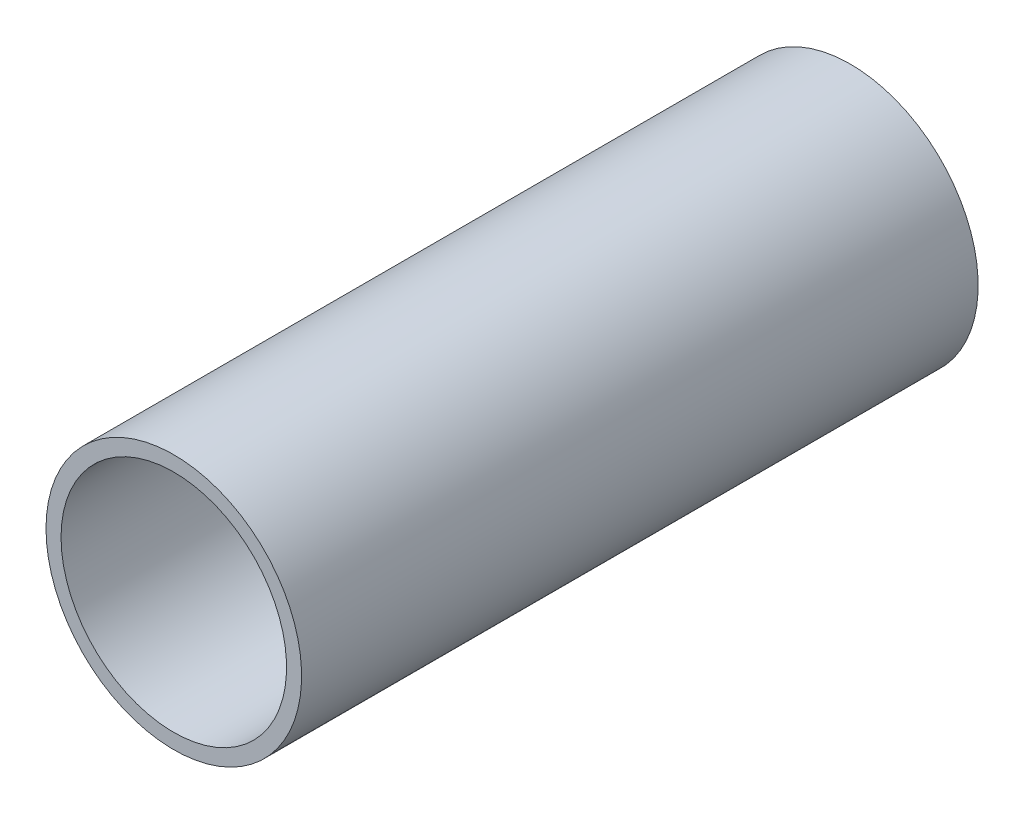
ISO-10303-21;
HEADER;
FILE_DESCRIPTION(('STEP AP214'),'2;1');
FILE_NAME('part.step','',(''),(''),'','','');
FILE_SCHEMA(('AUTOMOTIVE_DESIGN { 1 0 10303 214 1 1 1 1 }'));
ENDSEC;
DATA;
#1=APPLICATION_CONTEXT('core data for automotive mechanical design processes');
#2=APPLICATION_PROTOCOL_DEFINITION('international standard','automotive_design',2000,#1);
#3=PRODUCT_CONTEXT('',#1,'mechanical');
#4=PRODUCT('Part','Part','',(#3));
#5=PRODUCT_RELATED_PRODUCT_CATEGORY('part','',(#4));
#6=PRODUCT_DEFINITION_FORMATION('','',#4);
#7=PRODUCT_DEFINITION_CONTEXT('part definition',#1,'design');
#8=PRODUCT_DEFINITION('design','',#6,#7);
#9=PRODUCT_DEFINITION_SHAPE('','',#8);
#10=(LENGTH_UNIT() NAMED_UNIT(*) SI_UNIT(.MILLI.,.METRE.));
#11=(NAMED_UNIT(*) PLANE_ANGLE_UNIT() SI_UNIT($,.RADIAN.));
#12=(NAMED_UNIT(*) SI_UNIT($,.STERADIAN.) SOLID_ANGLE_UNIT());
#13=UNCERTAINTY_MEASURE_WITH_UNIT(LENGTH_MEASURE(1.E-05),#10,'distance_accuracy_value','');
#14=(GEOMETRIC_REPRESENTATION_CONTEXT(3) GLOBAL_UNCERTAINTY_ASSIGNED_CONTEXT((#13)) GLOBAL_UNIT_ASSIGNED_CONTEXT((#10,
#11,#12)) REPRESENTATION_CONTEXT('',''));
#15=CARTESIAN_POINT('',(0.,0.,0.));
#16=DIRECTION('',(0.,0.,1.));
#17=DIRECTION('',(1.,0.,0.));
#18=AXIS2_PLACEMENT_3D('',#15,#16,#17);
#19=CARTESIAN_POINT('',(0.,0.,90.));
#20=DIRECTION('',(0.,0.,1.));
#21=DIRECTION('',(1.,0.,0.));
#22=AXIS2_PLACEMENT_3D('',#19,#20,#21);
#23=PLANE('',#22);
#24=CARTESIAN_POINT('',(0.,0.,90.));
#25=DIRECTION('',(0.,0.,1.));
#26=DIRECTION('',(1.,0.,0.));
#27=AXIS2_PLACEMENT_3D('',#24,#25,#26);
#28=CIRCLE('',#27,17.);
#29=CARTESIAN_POINT('',(-17.,0.,90.));
#30=VERTEX_POINT('',#29);
#31=EDGE_CURVE('E10',#30,#30,#28,.T.);
#32=ORIENTED_EDGE('',*,*,#31,.T.);
#33=EDGE_LOOP('',(#32));
#34=FACE_BOUND('',#33,.T.);
#35=CARTESIAN_POINT('',(0.,0.,90.));
#36=DIRECTION('',(0.,0.,1.));
#37=DIRECTION('',(1.,0.,0.));
#38=AXIS2_PLACEMENT_3D('',#35,#36,#37);
#39=CIRCLE('',#38,15.);
#40=CARTESIAN_POINT('',(-15.,0.,90.));
#41=VERTEX_POINT('',#40);
#42=EDGE_CURVE('E42',#41,#41,#39,.T.);
#43=ORIENTED_EDGE('',*,*,#42,.F.);
#44=EDGE_LOOP('',(#43));
#45=FACE_BOUND('',#44,.T.);
#46=ADVANCED_FACE('F31',(#34,#45),#23,.T.);
#47=CARTESIAN_POINT('',(0.,0.,0.));
#48=DIRECTION('',(0.,0.,1.));
#49=DIRECTION('',(1.,0.,0.));
#50=AXIS2_PLACEMENT_3D('',#47,#48,#49);
#51=PLANE('',#50);
#52=CARTESIAN_POINT('',(0.,0.,0.));
#53=DIRECTION('',(0.,0.,1.));
#54=DIRECTION('',(1.,0.,0.));
#55=AXIS2_PLACEMENT_3D('',#52,#53,#54);
#56=CIRCLE('',#55,17.);
#57=CARTESIAN_POINT('',(-17.,0.,0.));
#58=VERTEX_POINT('',#57);
#59=EDGE_CURVE('E35',#58,#58,#56,.T.);
#60=ORIENTED_EDGE('',*,*,#59,.F.);
#61=EDGE_LOOP('',(#60));
#62=FACE_BOUND('',#61,.T.);
#63=CARTESIAN_POINT('',(0.,0.,0.));
#64=DIRECTION('',(0.,0.,1.));
#65=DIRECTION('',(1.,0.,0.));
#66=AXIS2_PLACEMENT_3D('',#63,#64,#65);
#67=CIRCLE('',#66,15.);
#68=CARTESIAN_POINT('',(-15.,0.,0.));
#69=VERTEX_POINT('',#68);
#70=EDGE_CURVE('E44',#69,#69,#67,.T.);
#71=ORIENTED_EDGE('',*,*,#70,.T.);
#72=EDGE_LOOP('',(#71));
#73=FACE_BOUND('',#72,.T.);
#74=ADVANCED_FACE('F54',(#62,#73),#51,.F.);
#75=CARTESIAN_POINT('',(0.,0.,90.));
#76=DIRECTION('',(0.,0.,-1.));
#77=DIRECTION('',(-1.,0.,0.));
#78=AXIS2_PLACEMENT_3D('',#75,#76,#77);
#79=CYLINDRICAL_SURFACE('',#78,17.);
#80=CARTESIAN_POINT('',(-17.,0.,90.));
#81=CARTESIAN_POINT('',(-17.,0.,89.0625));
#82=CARTESIAN_POINT('',(-17.,0.,88.125));
#83=CARTESIAN_POINT('',(-17.,0.,86.25));
#84=CARTESIAN_POINT('',(-17.,0.,85.3125));
#85=CARTESIAN_POINT('',(-17.,0.,83.4375));
#86=CARTESIAN_POINT('',(-17.,0.,82.5));
#87=CARTESIAN_POINT('',(-17.,0.,80.625));
#88=CARTESIAN_POINT('',(-17.,0.,79.6875));
#89=CARTESIAN_POINT('',(-17.,0.,77.8125));
#90=CARTESIAN_POINT('',(-17.,0.,76.875));
#91=CARTESIAN_POINT('',(-17.,0.,75.));
#92=CARTESIAN_POINT('',(-17.,0.,74.0625));
#93=CARTESIAN_POINT('',(-17.,0.,72.1875));
#94=CARTESIAN_POINT('',(-17.,0.,71.25));
#95=CARTESIAN_POINT('',(-17.,0.,69.375));
#96=CARTESIAN_POINT('',(-17.,0.,68.4375));
#97=CARTESIAN_POINT('',(-17.,0.,66.5625));
#98=CARTESIAN_POINT('',(-17.,0.,65.625));
#99=CARTESIAN_POINT('',(-17.,0.,63.75));
#100=CARTESIAN_POINT('',(-17.,0.,62.8125));
#101=CARTESIAN_POINT('',(-17.,0.,60.9375));
#102=CARTESIAN_POINT('',(-17.,0.,60.));
#103=CARTESIAN_POINT('',(-17.,0.,58.125));
#104=CARTESIAN_POINT('',(-17.,0.,57.1875));
#105=CARTESIAN_POINT('',(-17.,0.,55.3125));
#106=CARTESIAN_POINT('',(-17.,0.,54.375));
#107=CARTESIAN_POINT('',(-17.,0.,52.5));
#108=CARTESIAN_POINT('',(-17.,0.,51.5625));
#109=CARTESIAN_POINT('',(-17.,0.,49.6875));
#110=CARTESIAN_POINT('',(-17.,0.,48.75));
#111=CARTESIAN_POINT('',(-17.,0.,46.875));
#112=CARTESIAN_POINT('',(-17.,0.,45.9375));
#113=CARTESIAN_POINT('',(-17.,0.,44.0625));
#114=CARTESIAN_POINT('',(-17.,0.,43.125));
#115=CARTESIAN_POINT('',(-17.,0.,41.25));
#116=CARTESIAN_POINT('',(-17.,0.,40.3125));
#117=CARTESIAN_POINT('',(-17.,0.,38.4375));
#118=CARTESIAN_POINT('',(-17.,0.,37.5));
#119=CARTESIAN_POINT('',(-17.,0.,35.625));
#120=CARTESIAN_POINT('',(-17.,0.,34.6875));
#121=CARTESIAN_POINT('',(-17.,0.,32.8125));
#122=CARTESIAN_POINT('',(-17.,0.,31.875));
#123=CARTESIAN_POINT('',(-17.,0.,30.));
#124=CARTESIAN_POINT('',(-17.,0.,29.0625));
#125=CARTESIAN_POINT('',(-17.,0.,27.1875));
#126=CARTESIAN_POINT('',(-17.,0.,26.25));
#127=CARTESIAN_POINT('',(-17.,0.,24.375));
#128=CARTESIAN_POINT('',(-17.,0.,23.4375));
#129=CARTESIAN_POINT('',(-17.,0.,21.5625));
#130=CARTESIAN_POINT('',(-17.,0.,20.625));
#131=CARTESIAN_POINT('',(-17.,0.,18.75));
#132=CARTESIAN_POINT('',(-17.,0.,17.8125));
#133=CARTESIAN_POINT('',(-17.,0.,15.9375));
#134=CARTESIAN_POINT('',(-17.,0.,15.));
#135=CARTESIAN_POINT('',(-17.,0.,13.125));
#136=CARTESIAN_POINT('',(-17.,0.,12.1875));
#137=CARTESIAN_POINT('',(-17.,0.,10.3125));
#138=CARTESIAN_POINT('',(-17.,0.,9.37499999999999));
#139=CARTESIAN_POINT('',(-17.,0.,7.49999999999999));
#140=CARTESIAN_POINT('',(-17.,0.,6.56249999999999));
#141=CARTESIAN_POINT('',(-17.,0.,4.68749999999999));
#142=CARTESIAN_POINT('',(-17.,0.,3.74999999999998));
#143=CARTESIAN_POINT('',(-17.,0.,1.87499999999998));
#144=CARTESIAN_POINT('',(-17.,0.,0.937499999999986));
#145=CARTESIAN_POINT('',(-17.,0.,0.));
#146=B_SPLINE_CURVE_WITH_KNOTS('',3,(#80,#81,#82,#83,#84,#85,#86,#87,#88,#89,#90,#91,#92,#93,
#94,#95,#96,#97,#98,#99,#100,#101,#102,#103,#104,#105,#106,#107,#108,#109,#110,#111,#112,#113,
#114,#115,#116,#117,#118,#119,#120,#121,#122,#123,#124,#125,#126,#127,#128,#129,#130,#131,#132,
#133,#134,#135,#136,#137,#138,#139,#140,#141,#142,#143,#144,#145),.UNSPECIFIED.,.F.,.F.,(4,2,2,
2,2,2,2,2,2,2,2,2,2,2,2,2,2,2,2,2,2,2,2,2,2,2,2,2,2,2,2,2,4),(0.,2.81250000000001,
5.62500000000001,8.43750000000001,11.25,14.0625,16.875,19.6875,22.5,25.3125,28.125,30.9375,
33.75,36.5625,39.375,42.1875,45.,47.8125,50.625,53.4375,56.25,59.0625,61.875,64.6875,67.5,
70.3125,73.125,75.9375,78.75,81.5625,84.375,87.1875,90.),.UNSPECIFIED.);
#147=EDGE_CURVE('BSEAM33',#30,#58,#146,.T.);
#148=ORIENTED_EDGE('',*,*,#31,.F.);
#149=ORIENTED_EDGE('',*,*,#59,.T.);
#150=ORIENTED_EDGE('',*,*,#147,.T.);
#151=ORIENTED_EDGE('',*,*,#147,.F.);
#152=EDGE_LOOP('',(#148,#150,#149,#151));
#153=FACE_BOUND('',#152,.T.);
#154=ADVANCED_FACE('F33',(#153),#79,.T.);
#155=CARTESIAN_POINT('',(0.,0.,90.));
#156=DIRECTION('',(0.,0.,-1.));
#157=DIRECTION('',(-1.,0.,0.));
#158=AXIS2_PLACEMENT_3D('',#155,#156,#157);
#159=CYLINDRICAL_SURFACE('',#158,15.);
#160=CARTESIAN_POINT('',(-15.,0.,90.));
#161=CARTESIAN_POINT('',(-15.,0.,89.0625));
#162=CARTESIAN_POINT('',(-15.,0.,88.125));
#163=CARTESIAN_POINT('',(-15.,0.,86.25));
#164=CARTESIAN_POINT('',(-15.,0.,85.3125));
#165=CARTESIAN_POINT('',(-15.,0.,83.4375));
#166=CARTESIAN_POINT('',(-15.,0.,82.5));
#167=CARTESIAN_POINT('',(-15.,0.,80.625));
#168=CARTESIAN_POINT('',(-15.,0.,79.6875));
#169=CARTESIAN_POINT('',(-15.,0.,77.8125));
#170=CARTESIAN_POINT('',(-15.,0.,76.875));
#171=CARTESIAN_POINT('',(-15.,0.,75.));
#172=CARTESIAN_POINT('',(-15.,0.,74.0625));
#173=CARTESIAN_POINT('',(-15.,0.,72.1875));
#174=CARTESIAN_POINT('',(-15.,0.,71.25));
#175=CARTESIAN_POINT('',(-15.,0.,69.375));
#176=CARTESIAN_POINT('',(-15.,0.,68.4375));
#177=CARTESIAN_POINT('',(-15.,0.,66.5625));
#178=CARTESIAN_POINT('',(-15.,0.,65.625));
#179=CARTESIAN_POINT('',(-15.,0.,63.75));
#180=CARTESIAN_POINT('',(-15.,0.,62.8125));
#181=CARTESIAN_POINT('',(-15.,0.,60.9375));
#182=CARTESIAN_POINT('',(-15.,0.,60.));
#183=CARTESIAN_POINT('',(-15.,0.,58.125));
#184=CARTESIAN_POINT('',(-15.,0.,57.1875));
#185=CARTESIAN_POINT('',(-15.,0.,55.3125));
#186=CARTESIAN_POINT('',(-15.,0.,54.375));
#187=CARTESIAN_POINT('',(-15.,0.,52.5));
#188=CARTESIAN_POINT('',(-15.,0.,51.5625));
#189=CARTESIAN_POINT('',(-15.,0.,49.6875));
#190=CARTESIAN_POINT('',(-15.,0.,48.75));
#191=CARTESIAN_POINT('',(-15.,0.,46.875));
#192=CARTESIAN_POINT('',(-15.,0.,45.9375));
#193=CARTESIAN_POINT('',(-15.,0.,44.0625));
#194=CARTESIAN_POINT('',(-15.,0.,43.125));
#195=CARTESIAN_POINT('',(-15.,0.,41.25));
#196=CARTESIAN_POINT('',(-15.,0.,40.3125));
#197=CARTESIAN_POINT('',(-15.,0.,38.4375));
#198=CARTESIAN_POINT('',(-15.,0.,37.5));
#199=CARTESIAN_POINT('',(-15.,0.,35.625));
#200=CARTESIAN_POINT('',(-15.,0.,34.6875));
#201=CARTESIAN_POINT('',(-15.,0.,32.8125));
#202=CARTESIAN_POINT('',(-15.,0.,31.875));
#203=CARTESIAN_POINT('',(-15.,0.,30.));
#204=CARTESIAN_POINT('',(-15.,0.,29.0625));
#205=CARTESIAN_POINT('',(-15.,0.,27.1875));
#206=CARTESIAN_POINT('',(-15.,0.,26.25));
#207=CARTESIAN_POINT('',(-15.,0.,24.375));
#208=CARTESIAN_POINT('',(-15.,0.,23.4375));
#209=CARTESIAN_POINT('',(-15.,0.,21.5625));
#210=CARTESIAN_POINT('',(-15.,0.,20.625));
#211=CARTESIAN_POINT('',(-15.,0.,18.75));
#212=CARTESIAN_POINT('',(-15.,0.,17.8125));
#213=CARTESIAN_POINT('',(-15.,0.,15.9375));
#214=CARTESIAN_POINT('',(-15.,0.,15.));
#215=CARTESIAN_POINT('',(-15.,0.,13.125));
#216=CARTESIAN_POINT('',(-15.,0.,12.1875));
#217=CARTESIAN_POINT('',(-15.,0.,10.3125));
#218=CARTESIAN_POINT('',(-15.,0.,9.37499999999999));
#219=CARTESIAN_POINT('',(-15.,0.,7.49999999999999));
#220=CARTESIAN_POINT('',(-15.,0.,6.56249999999999));
#221=CARTESIAN_POINT('',(-15.,0.,4.68749999999999));
#222=CARTESIAN_POINT('',(-15.,0.,3.74999999999998));
#223=CARTESIAN_POINT('',(-15.,0.,1.87499999999998));
#224=CARTESIAN_POINT('',(-15.,0.,0.937499999999986));
#225=CARTESIAN_POINT('',(-15.,0.,0.));
#226=B_SPLINE_CURVE_WITH_KNOTS('',3,(#160,#161,#162,#163,#164,#165,#166,#167,#168,#169,#170,
#171,#172,#173,#174,#175,#176,#177,#178,#179,#180,#181,#182,#183,#184,#185,#186,#187,#188,#189,
#190,#191,#192,#193,#194,#195,#196,#197,#198,#199,#200,#201,#202,#203,#204,#205,#206,#207,#208,
#209,#210,#211,#212,#213,#214,#215,#216,#217,#218,#219,#220,#221,#222,#223,#224,#225),
.UNSPECIFIED.,.F.,.F.,(4,2,2,2,2,2,2,2,2,2,2,2,2,2,2,2,2,2,2,2,2,2,2,2,2,2,2,2,2,2,2,2,4),(0.,
2.8125,5.62499999999999,8.43749999999999,11.25,14.0625,16.875,19.6875,22.5,25.3125,28.125,
30.9375,33.75,36.5625,39.375,42.1875,45.,47.8125,50.625,53.4375,56.25,59.0625,61.875,64.6875,
67.5,70.3125,73.125,75.9375,78.75,81.5625,84.375,87.1875,90.),.UNSPECIFIED.);
#227=EDGE_CURVE('BSEAM50',#41,#69,#226,.T.);
#228=ORIENTED_EDGE('',*,*,#42,.T.);
#229=ORIENTED_EDGE('',*,*,#70,.F.);
#230=ORIENTED_EDGE('',*,*,#227,.T.);
#231=ORIENTED_EDGE('',*,*,#227,.F.);
#232=EDGE_LOOP('',(#228,#230,#229,#231));
#233=FACE_BOUND('',#232,.T.);
#234=ADVANCED_FACE('F50',(#233),#159,.F.);
#235=CLOSED_SHELL('',(#46,#74,#154,#234));
#236=MANIFOLD_SOLID_BREP('B2',#235);
#237=ADVANCED_BREP_SHAPE_REPRESENTATION('',(#18,#236),#14);
#238=SHAPE_DEFINITION_REPRESENTATION(#9,#237);
ENDSEC;
END-ISO-10303-21;
